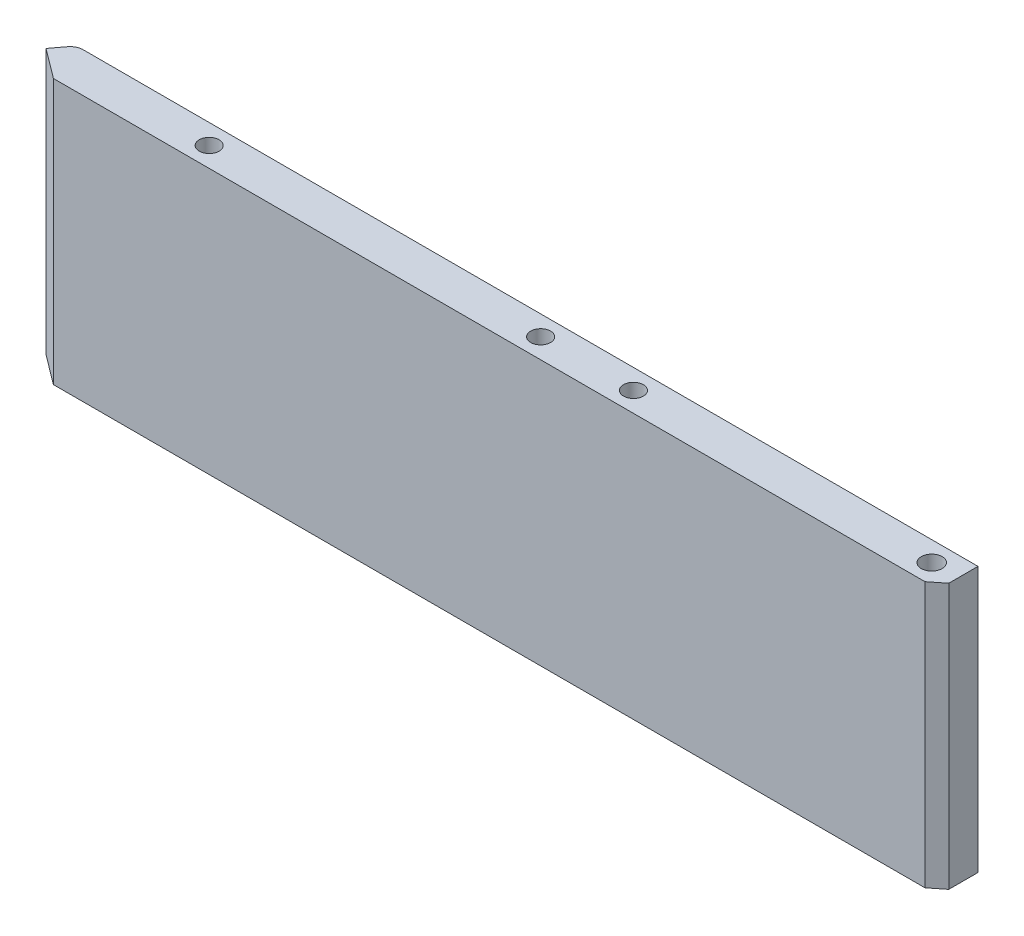
ISO-10303-21;
HEADER;
FILE_DESCRIPTION(('STEP AP214'),'2;1');
FILE_NAME('part.step','',(''),(''),'','','');
FILE_SCHEMA(('AUTOMOTIVE_DESIGN { 1 0 10303 214 1 1 1 1 }'));
ENDSEC;
DATA;
#1=APPLICATION_CONTEXT('core data for automotive mechanical design processes');
#2=APPLICATION_PROTOCOL_DEFINITION('international standard','automotive_design',2000,#1);
#3=PRODUCT_CONTEXT('',#1,'mechanical');
#4=PRODUCT('Part','Part','',(#3));
#5=PRODUCT_RELATED_PRODUCT_CATEGORY('part','',(#4));
#6=PRODUCT_DEFINITION_FORMATION('','',#4);
#7=PRODUCT_DEFINITION_CONTEXT('part definition',#1,'design');
#8=PRODUCT_DEFINITION('design','',#6,#7);
#9=PRODUCT_DEFINITION_SHAPE('','',#8);
#10=(LENGTH_UNIT() NAMED_UNIT(*) SI_UNIT(.MILLI.,.METRE.));
#11=(NAMED_UNIT(*) PLANE_ANGLE_UNIT() SI_UNIT($,.RADIAN.));
#12=(NAMED_UNIT(*) SI_UNIT($,.STERADIAN.) SOLID_ANGLE_UNIT());
#13=UNCERTAINTY_MEASURE_WITH_UNIT(LENGTH_MEASURE(1.E-05),#10,'distance_accuracy_value','');
#14=(GEOMETRIC_REPRESENTATION_CONTEXT(3) GLOBAL_UNCERTAINTY_ASSIGNED_CONTEXT((#13)) GLOBAL_UNIT_ASSIGNED_CONTEXT((#10,
#11,#12)) REPRESENTATION_CONTEXT('',''));
#15=CARTESIAN_POINT('',(0.,0.,0.));
#16=DIRECTION('',(0.,0.,1.));
#17=DIRECTION('',(1.,0.,0.));
#18=AXIS2_PLACEMENT_3D('',#15,#16,#17);
#19=CARTESIAN_POINT('',(77.5,20.,-33.9999999999998));
#20=DIRECTION('',(0.,0.,-1.));
#21=DIRECTION('',(-1.,0.,0.));
#22=AXIS2_PLACEMENT_3D('',#19,#20,#21);
#23=PLANE('',#22);
#24=DIRECTION('',(0.,-1.,0.));
#25=VECTOR('',#24,1.);
#26=CARTESIAN_POINT('',(53.9800000000001,20.,-33.9999999999998));
#27=LINE('',#26,#25);
#28=CARTESIAN_POINT('',(53.9800000000001,20.,-33.9999999999998));
#29=VERTEX_POINT('',#28);
#30=CARTESIAN_POINT('',(53.9800000000001,-20.,-33.9999999999998));
#31=VERTEX_POINT('',#30);
#32=EDGE_CURVE('E63',#29,#31,#27,.T.);
#33=ORIENTED_EDGE('',*,*,#32,.F.);
#34=DIRECTION('',(1.,0.,0.));
#35=VECTOR('',#34,1.);
#36=CARTESIAN_POINT('',(0.,20.,-33.9999999999998));
#37=LINE('',#36,#35);
#38=CARTESIAN_POINT('',(-77.5,20.,-33.9999999999998));
#39=VERTEX_POINT('',#38);
#40=EDGE_CURVE('E130',#39,#29,#37,.T.);
#41=ORIENTED_EDGE('',*,*,#40,.F.);
#42=DIRECTION('',(0.,-1.,0.));
#43=VECTOR('',#42,1.);
#44=CARTESIAN_POINT('',(-77.5,20.,-33.9999999999998));
#45=LINE('',#44,#43);
#46=CARTESIAN_POINT('',(-77.5,-20.,-33.9999999999998));
#47=VERTEX_POINT('',#46);
#48=EDGE_CURVE('E108',#39,#47,#45,.T.);
#49=ORIENTED_EDGE('',*,*,#48,.T.);
#50=DIRECTION('',(-1.,0.,0.));
#51=VECTOR('',#50,1.);
#52=CARTESIAN_POINT('',(77.5,-20.,-33.9999999999998));
#53=LINE('',#52,#51);
#54=EDGE_CURVE('E148',#47,#31,#53,.F.);
#55=ORIENTED_EDGE('',*,*,#54,.T.);
#56=EDGE_LOOP('',(#33,#41,#49,#55));
#57=FACE_BOUND('',#56,.T.);
#58=ADVANCED_FACE('F44',(#57),#23,.F.);
#59=CARTESIAN_POINT('',(0.,20.,0.));
#60=DIRECTION('',(0.,-1.,0.));
#61=DIRECTION('',(0.,0.,-1.));
#62=AXIS2_PLACEMENT_3D('',#59,#60,#61);
#63=PLANE('',#62);
#64=CARTESIAN_POINT('',(-57.,20.,-36.9999999999998));
#65=DIRECTION('',(0.,1.,0.));
#66=DIRECTION('',(0.,0.,1.));
#67=AXIS2_PLACEMENT_3D('',#64,#65,#66);
#68=CIRCLE('',#67,1.5);
#69=CARTESIAN_POINT('',(-57.,20.,-35.4999999999998));
#70=VERTEX_POINT('',#69);
#71=EDGE_CURVE('E156',#70,#70,#68,.T.);
#72=ORIENTED_EDGE('',*,*,#71,.F.);
#73=EDGE_LOOP('',(#72));
#74=FACE_BOUND('',#73,.T.);
#75=CARTESIAN_POINT('',(-7.,20.,-36.9999999999998));
#76=DIRECTION('',(0.,1.,0.));
#77=DIRECTION('',(0.,0.,1.));
#78=AXIS2_PLACEMENT_3D('',#75,#76,#77);
#79=CIRCLE('',#78,1.5);
#80=CARTESIAN_POINT('',(-7.,20.,-35.4999999999998));
#81=VERTEX_POINT('',#80);
#82=EDGE_CURVE('E169',#81,#81,#79,.T.);
#83=ORIENTED_EDGE('',*,*,#82,.F.);
#84=EDGE_LOOP('',(#83));
#85=FACE_BOUND('',#84,.T.);
#86=CARTESIAN_POINT('',(7.,20.,-36.9999999999998));
#87=DIRECTION('',(0.,1.,0.));
#88=DIRECTION('',(0.,0.,-1.));
#89=AXIS2_PLACEMENT_3D('',#86,#87,#88);
#90=CIRCLE('',#89,1.5);
#91=CARTESIAN_POINT('',(7.,20.,-38.4999999999998));
#92=VERTEX_POINT('',#91);
#93=EDGE_CURVE('E181',#92,#92,#90,.T.);
#94=ORIENTED_EDGE('',*,*,#93,.F.);
#95=EDGE_LOOP('',(#94));
#96=FACE_BOUND('',#95,.T.);
#97=CARTESIAN_POINT('',(52.,20.,-36.9999999999998));
#98=DIRECTION('',(0.,1.,0.));
#99=DIRECTION('',(0.,0.,1.));
#100=AXIS2_PLACEMENT_3D('',#97,#98,#99);
#101=CIRCLE('',#100,1.57251587518237);
#102=CARTESIAN_POINT('',(52.,20.,-35.4274841248174));
#103=VERTEX_POINT('',#102);
#104=EDGE_CURVE('E189',#103,#103,#101,.T.);
#105=ORIENTED_EDGE('',*,*,#104,.F.);
#106=EDGE_LOOP('',(#105));
#107=FACE_BOUND('',#106,.T.);
#108=ORIENTED_EDGE('',*,*,#40,.T.);
#109=DIRECTION('',(0.783151105290948,0.,-0.621831445233808));
#110=VECTOR('',#109,1.);
#111=CARTESIAN_POINT('',(55.9800000000001,20.,-35.5880241783039));
#112=LINE('',#111,#110);
#113=CARTESIAN_POINT('',(55.9800000000001,20.,-35.5880241783039));
#114=VERTEX_POINT('',#113);
#115=EDGE_CURVE('E155',#29,#114,#112,.T.);
#116=ORIENTED_EDGE('',*,*,#115,.T.);
#117=DIRECTION('',(0.,0.,1.));
#118=VECTOR('',#117,1.);
#119=CARTESIAN_POINT('',(55.9800000000001,20.,-39.9999999999998));
#120=LINE('',#119,#118);
#121=CARTESIAN_POINT('',(55.9800000000001,20.,-39.9999999999998));
#122=VERTEX_POINT('',#121);
#123=EDGE_CURVE('E150',#122,#114,#120,.T.);
#124=ORIENTED_EDGE('',*,*,#123,.F.);
#125=DIRECTION('',(-1.,0.,0.));
#126=VECTOR('',#125,1.);
#127=CARTESIAN_POINT('',(-80.,20.,-39.9999999999998));
#128=LINE('',#127,#126);
#129=CARTESIAN_POINT('',(-79.,20.,-39.9999999999998));
#130=VERTEX_POINT('',#129);
#131=EDGE_CURVE('E132',#122,#130,#128,.T.);
#132=ORIENTED_EDGE('',*,*,#131,.T.);
#133=CARTESIAN_POINT('',(-79.,20.,-37.9999999999998));
#134=DIRECTION('',(0.,-1.,0.));
#135=DIRECTION('',(0.,0.,-1.));
#136=AXIS2_PLACEMENT_3D('',#133,#134,#135);
#137=CIRCLE('',#136,2.);
#138=CARTESIAN_POINT('',(-80.6,20.,-39.1999999999998));
#139=VERTEX_POINT('',#138);
#140=EDGE_CURVE('E205',#130,#139,#137,.F.);
#141=ORIENTED_EDGE('',*,*,#140,.T.);
#142=DIRECTION('',(-0.6,0.,0.8));
#143=VECTOR('',#142,1.);
#144=CARTESIAN_POINT('',(-110.,20.,1.76566830699974E-13));
#145=LINE('',#144,#143);
#146=CARTESIAN_POINT('',(-81.98,20.,-37.3599999999998));
#147=VERTEX_POINT('',#146);
#148=EDGE_CURVE('E119',#139,#147,#145,.T.);
#149=ORIENTED_EDGE('',*,*,#148,.T.);
#150=DIRECTION('',(0.8,0.,0.6));
#151=VECTOR('',#150,1.);
#152=CARTESIAN_POINT('',(-11.5800000000001,20.,15.4400000000001));
#153=LINE('',#152,#151);
#154=EDGE_CURVE('E111',#147,#39,#153,.T.);
#155=ORIENTED_EDGE('',*,*,#154,.T.);
#156=EDGE_LOOP('',(#108,#116,#124,#132,#141,#149,#155));
#157=FACE_BOUND('',#156,.T.);
#158=ADVANCED_FACE('F123',(#74,#85,#96,#107,#157),#63,.F.);
#159=CARTESIAN_POINT('',(0.,-20.,0.));
#160=DIRECTION('',(0.,-1.,0.));
#161=DIRECTION('',(0.,0.,-1.));
#162=AXIS2_PLACEMENT_3D('',#159,#160,#161);
#163=PLANE('',#162);
#164=DIRECTION('',(0.783151105290948,0.,-0.621831445233808));
#165=VECTOR('',#164,1.);
#166=CARTESIAN_POINT('',(4.31508976853524,-20.,5.43453913043493));
#167=LINE('',#166,#165);
#168=CARTESIAN_POINT('',(55.98,-20.,-35.5880241783039));
#169=VERTEX_POINT('',#168);
#170=EDGE_CURVE('E154',#31,#169,#167,.T.);
#171=ORIENTED_EDGE('',*,*,#170,.F.);
#172=ORIENTED_EDGE('',*,*,#54,.F.);
#173=DIRECTION('',(0.8,0.,0.6));
#174=VECTOR('',#173,1.);
#175=CARTESIAN_POINT('',(-101.18,-20.,-51.7599999999998));
#176=LINE('',#175,#174);
#177=CARTESIAN_POINT('',(-81.98,-20.,-37.3599999999998));
#178=VERTEX_POINT('',#177);
#179=EDGE_CURVE('E11',#178,#47,#176,.T.);
#180=ORIENTED_EDGE('',*,*,#179,.F.);
#181=DIRECTION('',(-0.6,0.,0.8));
#182=VECTOR('',#181,1.);
#183=CARTESIAN_POINT('',(-110.,-20.,1.76566830699974E-13));
#184=LINE('',#183,#182);
#185=CARTESIAN_POINT('',(-80.6,-20.,-39.1999999999998));
#186=VERTEX_POINT('',#185);
#187=EDGE_CURVE('E135',#186,#178,#184,.T.);
#188=ORIENTED_EDGE('',*,*,#187,.F.);
#189=CARTESIAN_POINT('',(-79.,-20.,-37.9999999999998));
#190=DIRECTION('',(0.,-1.,0.));
#191=DIRECTION('',(0.,0.,-1.));
#192=AXIS2_PLACEMENT_3D('',#189,#190,#191);
#193=CIRCLE('',#192,2.);
#194=CARTESIAN_POINT('',(-79.,-20.,-39.9999999999998));
#195=VERTEX_POINT('',#194);
#196=EDGE_CURVE('E200',#186,#195,#193,.T.);
#197=ORIENTED_EDGE('',*,*,#196,.T.);
#198=DIRECTION('',(-1.,0.,0.));
#199=VECTOR('',#198,1.);
#200=CARTESIAN_POINT('',(-80.,-20.,-39.9999999999998));
#201=LINE('',#200,#199);
#202=CARTESIAN_POINT('',(55.98,-20.,-39.9999999999998));
#203=VERTEX_POINT('',#202);
#204=EDGE_CURVE('E142',#203,#195,#201,.T.);
#205=ORIENTED_EDGE('',*,*,#204,.F.);
#206=DIRECTION('',(0.,0.,-1.));
#207=VECTOR('',#206,1.);
#208=CARTESIAN_POINT('',(55.98,-20.,0.));
#209=LINE('',#208,#207);
#210=EDGE_CURVE('E47',#203,#169,#209,.F.);
#211=ORIENTED_EDGE('',*,*,#210,.T.);
#212=EDGE_LOOP('',(#171,#172,#180,#188,#197,#205,#211));
#213=FACE_BOUND('',#212,.T.);
#214=ADVANCED_FACE('F214',(#213),#163,.T.);
#215=CARTESIAN_POINT('',(-80.,20.,-39.9999999999998));
#216=DIRECTION('',(0.,0.,1.));
#217=DIRECTION('',(1.,0.,0.));
#218=AXIS2_PLACEMENT_3D('',#215,#216,#217);
#219=PLANE('',#218);
#220=ORIENTED_EDGE('',*,*,#131,.F.);
#221=DIRECTION('',(0.,-1.,0.));
#222=VECTOR('',#221,1.);
#223=CARTESIAN_POINT('',(55.9800000000001,-20.,-39.9999999999998));
#224=LINE('',#223,#222);
#225=EDGE_CURVE('E89',#122,#203,#224,.T.);
#226=ORIENTED_EDGE('',*,*,#225,.T.);
#227=ORIENTED_EDGE('',*,*,#204,.T.);
#228=DIRECTION('',(0.,-1.,0.));
#229=VECTOR('',#228,1.);
#230=CARTESIAN_POINT('',(-79.,20.,-39.9999999999998));
#231=LINE('',#230,#229);
#232=EDGE_CURVE('E118',#195,#130,#231,.F.);
#233=ORIENTED_EDGE('',*,*,#232,.T.);
#234=EDGE_LOOP('',(#220,#226,#227,#233));
#235=FACE_BOUND('',#234,.T.);
#236=ADVANCED_FACE('F226',(#235),#219,.F.);
#237=CARTESIAN_POINT('',(-110.,20.,1.76566830699974E-13));
#238=DIRECTION('',(0.8,0.,0.6));
#239=DIRECTION('',(0.6,0.,-0.8));
#240=AXIS2_PLACEMENT_3D('',#237,#238,#239);
#241=PLANE('',#240);
#242=ORIENTED_EDGE('',*,*,#187,.T.);
#243=DIRECTION('',(0.,1.,0.));
#244=VECTOR('',#243,1.);
#245=CARTESIAN_POINT('',(-81.98,20.,-37.3599999999998));
#246=LINE('',#245,#244);
#247=EDGE_CURVE('E128',#178,#147,#246,.T.);
#248=ORIENTED_EDGE('',*,*,#247,.T.);
#249=ORIENTED_EDGE('',*,*,#148,.F.);
#250=DIRECTION('',(0.,-1.,0.));
#251=VECTOR('',#250,1.);
#252=CARTESIAN_POINT('',(-80.6,20.,-39.1999999999998));
#253=LINE('',#252,#251);
#254=EDGE_CURVE('E57',#139,#186,#253,.T.);
#255=ORIENTED_EDGE('',*,*,#254,.T.);
#256=EDGE_LOOP('',(#242,#248,#249,#255));
#257=FACE_BOUND('',#256,.T.);
#258=ADVANCED_FACE('F209',(#257),#241,.F.);
#259=CARTESIAN_POINT('',(52.,15.,-36.9999999999998));
#260=DIRECTION('',(0.,1.,0.));
#261=DIRECTION('',(0.,0.,1.));
#262=AXIS2_PLACEMENT_3D('',#259,#260,#261);
#263=CYLINDRICAL_SURFACE('',#262,1.57251587518237);
#264=CARTESIAN_POINT('',(52.,15.,-36.9999999999998));
#265=DIRECTION('',(0.,1.,0.));
#266=DIRECTION('',(0.,0.,1.));
#267=AXIS2_PLACEMENT_3D('',#264,#265,#266);
#268=CIRCLE('',#267,1.57251587518237);
#269=CARTESIAN_POINT('',(52.,15.,-35.4274841248174));
#270=VERTEX_POINT('',#269);
#271=EDGE_CURVE('E195',#270,#270,#268,.T.);
#272=ORIENTED_EDGE('',*,*,#271,.F.);
#273=EDGE_LOOP('',(#272));
#274=FACE_BOUND('',#273,.T.);
#275=ORIENTED_EDGE('',*,*,#104,.T.);
#276=EDGE_LOOP('',(#275));
#277=FACE_BOUND('',#276,.T.);
#278=ADVANCED_FACE('F247',(#274,#277),#263,.F.);
#279=CARTESIAN_POINT('',(52.,15.,-36.9999999999998));
#280=DIRECTION('',(0.,1.,0.));
#281=DIRECTION('',(0.,0.,1.));
#282=AXIS2_PLACEMENT_3D('',#279,#280,#281);
#283=PLANE('',#282);
#284=ORIENTED_EDGE('',*,*,#271,.T.);
#285=EDGE_LOOP('',(#284));
#286=FACE_BOUND('',#285,.T.);
#287=ADVANCED_FACE('F252',(#286),#283,.T.);
#288=CARTESIAN_POINT('',(7.,15.,-36.9999999999998));
#289=DIRECTION('',(0.,1.,0.));
#290=DIRECTION('',(0.,0.,1.));
#291=AXIS2_PLACEMENT_3D('',#288,#289,#290);
#292=CYLINDRICAL_SURFACE('',#291,1.5);
#293=CARTESIAN_POINT('',(7.,15.,-36.9999999999998));
#294=DIRECTION('',(0.,1.,0.));
#295=DIRECTION('',(0.,0.,-1.));
#296=AXIS2_PLACEMENT_3D('',#293,#294,#295);
#297=CIRCLE('',#296,1.5);
#298=CARTESIAN_POINT('',(7.,15.,-38.4999999999998));
#299=VERTEX_POINT('',#298);
#300=EDGE_CURVE('E183',#299,#299,#297,.T.);
#301=ORIENTED_EDGE('',*,*,#300,.F.);
#302=EDGE_LOOP('',(#301));
#303=FACE_BOUND('',#302,.T.);
#304=ORIENTED_EDGE('',*,*,#93,.T.);
#305=EDGE_LOOP('',(#304));
#306=FACE_BOUND('',#305,.T.);
#307=ADVANCED_FACE('F251',(#303,#306),#292,.F.);
#308=CARTESIAN_POINT('',(7.,15.,-36.9999999999998));
#309=DIRECTION('',(0.,-1.,0.));
#310=DIRECTION('',(0.,0.,-1.));
#311=AXIS2_PLACEMENT_3D('',#308,#309,#310);
#312=PLANE('',#311);
#313=ORIENTED_EDGE('',*,*,#300,.T.);
#314=EDGE_LOOP('',(#313));
#315=FACE_BOUND('',#314,.T.);
#316=ADVANCED_FACE('F256',(#315),#312,.F.);
#317=CARTESIAN_POINT('',(-7.,15.,-36.9999999999998));
#318=DIRECTION('',(0.,1.,0.));
#319=DIRECTION('',(0.,0.,1.));
#320=AXIS2_PLACEMENT_3D('',#317,#318,#319);
#321=CYLINDRICAL_SURFACE('',#320,1.5);
#322=CARTESIAN_POINT('',(-7.,15.,-36.9999999999998));
#323=DIRECTION('',(0.,1.,0.));
#324=DIRECTION('',(0.,0.,1.));
#325=AXIS2_PLACEMENT_3D('',#322,#323,#324);
#326=CIRCLE('',#325,1.5);
#327=CARTESIAN_POINT('',(-7.,15.,-35.4999999999998));
#328=VERTEX_POINT('',#327);
#329=EDGE_CURVE('E180',#328,#328,#326,.T.);
#330=ORIENTED_EDGE('',*,*,#329,.F.);
#331=EDGE_LOOP('',(#330));
#332=FACE_BOUND('',#331,.T.);
#333=ORIENTED_EDGE('',*,*,#82,.T.);
#334=EDGE_LOOP('',(#333));
#335=FACE_BOUND('',#334,.T.);
#336=ADVANCED_FACE('F264',(#332,#335),#321,.F.);
#337=CARTESIAN_POINT('',(-7.,15.,-36.9999999999998));
#338=DIRECTION('',(0.,1.,0.));
#339=DIRECTION('',(0.,0.,1.));
#340=AXIS2_PLACEMENT_3D('',#337,#338,#339);
#341=PLANE('',#340);
#342=ORIENTED_EDGE('',*,*,#329,.T.);
#343=EDGE_LOOP('',(#342));
#344=FACE_BOUND('',#343,.T.);
#345=ADVANCED_FACE('F270',(#344),#341,.T.);
#346=CARTESIAN_POINT('',(-57.,15.,-36.9999999999998));
#347=DIRECTION('',(0.,1.,0.));
#348=DIRECTION('',(0.,0.,1.));
#349=AXIS2_PLACEMENT_3D('',#346,#347,#348);
#350=CYLINDRICAL_SURFACE('',#349,1.5);
#351=CARTESIAN_POINT('',(-57.,15.,-36.9999999999998));
#352=DIRECTION('',(0.,1.,0.));
#353=DIRECTION('',(0.,0.,1.));
#354=AXIS2_PLACEMENT_3D('',#351,#352,#353);
#355=CIRCLE('',#354,1.5);
#356=CARTESIAN_POINT('',(-57.,15.,-35.4999999999998));
#357=VERTEX_POINT('',#356);
#358=EDGE_CURVE('E163',#357,#357,#355,.T.);
#359=ORIENTED_EDGE('',*,*,#358,.F.);
#360=EDGE_LOOP('',(#359));
#361=FACE_BOUND('',#360,.T.);
#362=ORIENTED_EDGE('',*,*,#71,.T.);
#363=EDGE_LOOP('',(#362));
#364=FACE_BOUND('',#363,.T.);
#365=ADVANCED_FACE('F232',(#361,#364),#350,.F.);
#366=CARTESIAN_POINT('',(-57.,15.,-36.9999999999998));
#367=DIRECTION('',(0.,1.,0.));
#368=DIRECTION('',(0.,0.,1.));
#369=AXIS2_PLACEMENT_3D('',#366,#367,#368);
#370=PLANE('',#369);
#371=ORIENTED_EDGE('',*,*,#358,.T.);
#372=EDGE_LOOP('',(#371));
#373=FACE_BOUND('',#372,.T.);
#374=ADVANCED_FACE('F229',(#373),#370,.T.);
#375=CARTESIAN_POINT('',(-79.,20.,-37.9999999999998));
#376=DIRECTION('',(0.,-1.,0.));
#377=DIRECTION('',(0.,0.,-1.));
#378=AXIS2_PLACEMENT_3D('',#375,#376,#377);
#379=CYLINDRICAL_SURFACE('',#378,2.);
#380=ORIENTED_EDGE('',*,*,#140,.F.);
#381=ORIENTED_EDGE('',*,*,#232,.F.);
#382=ORIENTED_EDGE('',*,*,#196,.F.);
#383=ORIENTED_EDGE('',*,*,#254,.F.);
#384=EDGE_LOOP('',(#380,#381,#382,#383));
#385=FACE_BOUND('',#384,.T.);
#386=ADVANCED_FACE('F50',(#385),#379,.T.);
#387=CARTESIAN_POINT('',(-101.18,-20.,-51.7599999999998));
#388=DIRECTION('',(0.6,0.,-0.8));
#389=DIRECTION('',(-0.8,0.,-0.6));
#390=AXIS2_PLACEMENT_3D('',#387,#388,#389);
#391=PLANE('',#390);
#392=ORIENTED_EDGE('',*,*,#154,.F.);
#393=ORIENTED_EDGE('',*,*,#247,.F.);
#394=ORIENTED_EDGE('',*,*,#179,.T.);
#395=ORIENTED_EDGE('',*,*,#48,.F.);
#396=EDGE_LOOP('',(#392,#393,#394,#395));
#397=FACE_BOUND('',#396,.T.);
#398=ADVANCED_FACE('F109',(#397),#391,.F.);
#399=CARTESIAN_POINT('',(55.9800000000001,-20.,-39.9999999999998));
#400=DIRECTION('',(-1.,0.,0.));
#401=DIRECTION('',(0.,0.,1.));
#402=AXIS2_PLACEMENT_3D('',#399,#400,#401);
#403=PLANE('',#402);
#404=ORIENTED_EDGE('',*,*,#123,.T.);
#405=DIRECTION('',(0.,-1.,0.));
#406=VECTOR('',#405,1.);
#407=CARTESIAN_POINT('',(55.9800000000001,20.,-35.5880241783039));
#408=LINE('',#407,#406);
#409=EDGE_CURVE('E149',#114,#169,#408,.T.);
#410=ORIENTED_EDGE('',*,*,#409,.T.);
#411=ORIENTED_EDGE('',*,*,#210,.F.);
#412=ORIENTED_EDGE('',*,*,#225,.F.);
#413=EDGE_LOOP('',(#404,#410,#411,#412));
#414=FACE_BOUND('',#413,.T.);
#415=ADVANCED_FACE('F219',(#414),#403,.F.);
#416=CARTESIAN_POINT('',(55.9800000000001,20.,-35.5880241783039));
#417=DIRECTION('',(-0.621831445233808,0.,-0.783151105290948));
#418=DIRECTION('',(-0.783151105290948,0.,0.621831445233808));
#419=AXIS2_PLACEMENT_3D('',#416,#417,#418);
#420=PLANE('',#419);
#421=ORIENTED_EDGE('',*,*,#409,.F.);
#422=ORIENTED_EDGE('',*,*,#115,.F.);
#423=ORIENTED_EDGE('',*,*,#32,.T.);
#424=ORIENTED_EDGE('',*,*,#170,.T.);
#425=EDGE_LOOP('',(#421,#422,#423,#424));
#426=FACE_BOUND('',#425,.T.);
#427=ADVANCED_FACE('F218',(#426),#420,.F.);
#428=CLOSED_SHELL('',(#58,#158,#214,#236,#258,#278,#287,#307,#316,#336,#345,#365,#374,#386,#398,
#415,#427));
#429=MANIFOLD_SOLID_BREP('B2',#428);
#430=ADVANCED_BREP_SHAPE_REPRESENTATION('',(#18,#429),#14);
#431=SHAPE_DEFINITION_REPRESENTATION(#9,#430);
ENDSEC;
END-ISO-10303-21;
